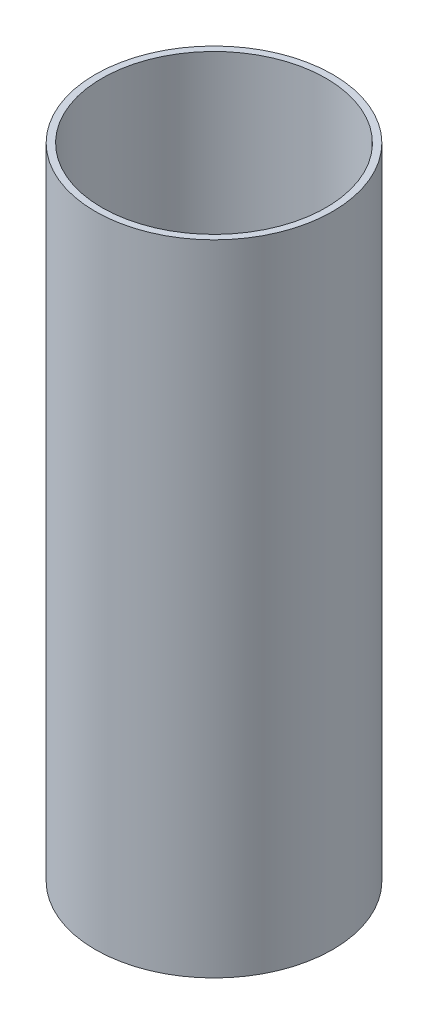
ISO-10303-21;
HEADER;
FILE_DESCRIPTION(('STEP AP214'),'2;1');
FILE_NAME('part.step','',(''),(''),'','','');
FILE_SCHEMA(('AUTOMOTIVE_DESIGN { 1 0 10303 214 1 1 1 1 }'));
ENDSEC;
DATA;
#1=APPLICATION_CONTEXT('core data for automotive mechanical design processes');
#2=APPLICATION_PROTOCOL_DEFINITION('international standard','automotive_design',2000,#1);
#3=PRODUCT_CONTEXT('',#1,'mechanical');
#4=PRODUCT('Part','Part','',(#3));
#5=PRODUCT_RELATED_PRODUCT_CATEGORY('part','',(#4));
#6=PRODUCT_DEFINITION_FORMATION('','',#4);
#7=PRODUCT_DEFINITION_CONTEXT('part definition',#1,'design');
#8=PRODUCT_DEFINITION('design','',#6,#7);
#9=PRODUCT_DEFINITION_SHAPE('','',#8);
#10=(LENGTH_UNIT() NAMED_UNIT(*) SI_UNIT(.MILLI.,.METRE.));
#11=(NAMED_UNIT(*) PLANE_ANGLE_UNIT() SI_UNIT($,.RADIAN.));
#12=(NAMED_UNIT(*) SI_UNIT($,.STERADIAN.) SOLID_ANGLE_UNIT());
#13=UNCERTAINTY_MEASURE_WITH_UNIT(LENGTH_MEASURE(1.E-05),#10,'distance_accuracy_value','');
#14=(GEOMETRIC_REPRESENTATION_CONTEXT(3) GLOBAL_UNCERTAINTY_ASSIGNED_CONTEXT((#13)) GLOBAL_UNIT_ASSIGNED_CONTEXT((#10,
#11,#12)) REPRESENTATION_CONTEXT('',''));
#15=CARTESIAN_POINT('',(0.,0.,0.));
#16=DIRECTION('',(0.,0.,1.));
#17=DIRECTION('',(1.,0.,0.));
#18=AXIS2_PLACEMENT_3D('',#15,#16,#17);
#19=CARTESIAN_POINT('',(0.,35.,0.));
#20=DIRECTION('',(0.,1.,0.));
#21=DIRECTION('',(0.,0.,1.));
#22=AXIS2_PLACEMENT_3D('',#19,#20,#21);
#23=PLANE('',#22);
#24=CARTESIAN_POINT('',(0.,35.,0.));
#25=DIRECTION('',(0.,1.,0.));
#26=DIRECTION('',(0.,0.,1.));
#27=AXIS2_PLACEMENT_3D('',#24,#25,#26);
#28=CIRCLE('',#27,6.5);
#29=CARTESIAN_POINT('',(0.,35.,6.5));
#30=VERTEX_POINT('',#29);
#31=EDGE_CURVE('E10',#30,#30,#28,.T.);
#32=ORIENTED_EDGE('',*,*,#31,.T.);
#33=EDGE_LOOP('',(#32));
#34=FACE_BOUND('',#33,.T.);
#35=CARTESIAN_POINT('',(0.,35.,0.));
#36=DIRECTION('',(0.,1.,0.));
#37=DIRECTION('',(0.,0.,1.));
#38=AXIS2_PLACEMENT_3D('',#35,#36,#37);
#39=CIRCLE('',#38,6.135);
#40=CARTESIAN_POINT('',(0.,35.,6.135));
#41=VERTEX_POINT('',#40);
#42=EDGE_CURVE('E56',#41,#41,#39,.T.);
#43=ORIENTED_EDGE('',*,*,#42,.F.);
#44=EDGE_LOOP('',(#43));
#45=FACE_BOUND('',#44,.T.);
#46=ADVANCED_FACE('F43',(#34,#45),#23,.T.);
#47=CARTESIAN_POINT('',(0.,0.,0.));
#48=DIRECTION('',(0.,1.,0.));
#49=DIRECTION('',(0.,0.,1.));
#50=AXIS2_PLACEMENT_3D('',#47,#48,#49);
#51=PLANE('',#50);
#52=CARTESIAN_POINT('',(0.,0.,0.));
#53=DIRECTION('',(0.,1.,0.));
#54=DIRECTION('',(0.,0.,1.));
#55=AXIS2_PLACEMENT_3D('',#52,#53,#54);
#56=CIRCLE('',#55,6.5);
#57=CARTESIAN_POINT('',(0.,0.,6.5));
#58=VERTEX_POINT('',#57);
#59=EDGE_CURVE('E47',#58,#58,#56,.T.);
#60=ORIENTED_EDGE('',*,*,#59,.F.);
#61=EDGE_LOOP('',(#60));
#62=FACE_BOUND('',#61,.T.);
#63=CARTESIAN_POINT('',(0.,0.,0.));
#64=DIRECTION('',(0.,1.,0.));
#65=DIRECTION('',(0.,0.,1.));
#66=AXIS2_PLACEMENT_3D('',#63,#64,#65);
#67=CIRCLE('',#66,6.135);
#68=CARTESIAN_POINT('',(0.,0.,6.135));
#69=VERTEX_POINT('',#68);
#70=EDGE_CURVE('E58',#69,#69,#67,.T.);
#71=ORIENTED_EDGE('',*,*,#70,.T.);
#72=EDGE_LOOP('',(#71));
#73=FACE_BOUND('',#72,.T.);
#74=ADVANCED_FACE('F70',(#62,#73),#51,.F.);
#75=CARTESIAN_POINT('',(0.,35.,0.));
#76=DIRECTION('',(0.,-1.,0.));
#77=DIRECTION('',(0.,0.,-1.));
#78=AXIS2_PLACEMENT_3D('',#75,#76,#77);
#79=CYLINDRICAL_SURFACE('',#78,6.5);
#80=ORIENTED_EDGE('',*,*,#31,.F.);
#81=EDGE_LOOP('',(#80));
#82=FACE_BOUND('',#81,.T.);
#83=ORIENTED_EDGE('',*,*,#59,.T.);
#84=EDGE_LOOP('',(#83));
#85=FACE_BOUND('',#84,.T.);
#86=ADVANCED_FACE('F45',(#82,#85),#79,.T.);
#87=CARTESIAN_POINT('',(0.,35.,0.));
#88=DIRECTION('',(0.,-1.,0.));
#89=DIRECTION('',(0.,0.,-1.));
#90=AXIS2_PLACEMENT_3D('',#87,#88,#89);
#91=CYLINDRICAL_SURFACE('',#90,6.135);
#92=ORIENTED_EDGE('',*,*,#42,.T.);
#93=EDGE_LOOP('',(#92));
#94=FACE_BOUND('',#93,.T.);
#95=ORIENTED_EDGE('',*,*,#70,.F.);
#96=EDGE_LOOP('',(#95));
#97=FACE_BOUND('',#96,.T.);
#98=ADVANCED_FACE('F66',(#94,#97),#91,.F.);
#99=CLOSED_SHELL('',(#46,#74,#86,#98));
#100=MANIFOLD_SOLID_BREP('B2',#99);
#101=ADVANCED_BREP_SHAPE_REPRESENTATION('',(#18,#100),#14);
#102=SHAPE_DEFINITION_REPRESENTATION(#9,#101);
ENDSEC;
END-ISO-10303-21;
